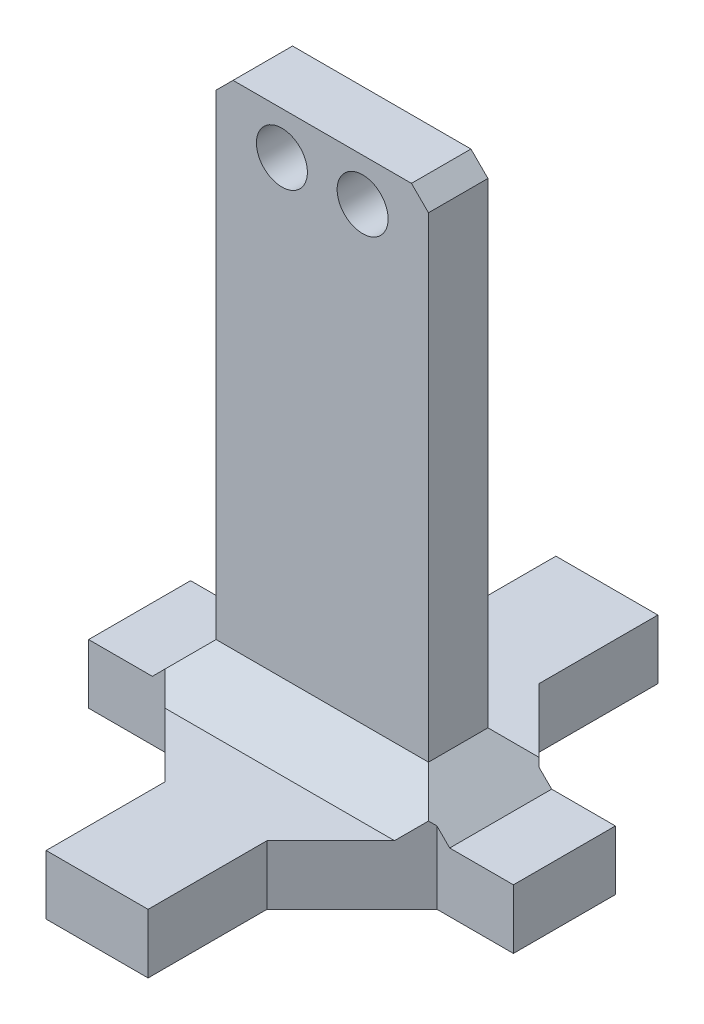
ISO-10303-21;
HEADER;
FILE_DESCRIPTION(('STEP AP214'),'2;1');
FILE_NAME('part.step','',(''),(''),'','','');
FILE_SCHEMA(('AUTOMOTIVE_DESIGN { 1 0 10303 214 1 1 1 1 }'));
ENDSEC;
DATA;
#1=APPLICATION_CONTEXT('core data for automotive mechanical design processes');
#2=APPLICATION_PROTOCOL_DEFINITION('international standard','automotive_design',2000,#1);
#3=PRODUCT_CONTEXT('',#1,'mechanical');
#4=PRODUCT('Part','Part','',(#3));
#5=PRODUCT_RELATED_PRODUCT_CATEGORY('part','',(#4));
#6=PRODUCT_DEFINITION_FORMATION('','',#4);
#7=PRODUCT_DEFINITION_CONTEXT('part definition',#1,'design');
#8=PRODUCT_DEFINITION('design','',#6,#7);
#9=PRODUCT_DEFINITION_SHAPE('','',#8);
#10=(LENGTH_UNIT() NAMED_UNIT(*) SI_UNIT(.MILLI.,.METRE.));
#11=(NAMED_UNIT(*) PLANE_ANGLE_UNIT() SI_UNIT($,.RADIAN.));
#12=(NAMED_UNIT(*) SI_UNIT($,.STERADIAN.) SOLID_ANGLE_UNIT());
#13=UNCERTAINTY_MEASURE_WITH_UNIT(LENGTH_MEASURE(1.E-05),#10,'distance_accuracy_value','');
#14=(GEOMETRIC_REPRESENTATION_CONTEXT(3) GLOBAL_UNCERTAINTY_ASSIGNED_CONTEXT((#13)) GLOBAL_UNIT_ASSIGNED_CONTEXT((#10,
#11,#12)) REPRESENTATION_CONTEXT('',''));
#15=CARTESIAN_POINT('',(0.,0.,0.));
#16=DIRECTION('',(0.,0.,1.));
#17=DIRECTION('',(1.,0.,0.));
#18=AXIS2_PLACEMENT_3D('',#15,#16,#17);
#19=CARTESIAN_POINT('',(0.,7.,0.));
#20=DIRECTION('',(0.,-1.,0.));
#21=DIRECTION('',(0.,0.,-1.));
#22=AXIS2_PLACEMENT_3D('',#19,#20,#21);
#23=PLANE('',#22);
#24=DIRECTION('',(1.,0.,0.));
#25=VECTOR('',#24,1.);
#26=CARTESIAN_POINT('',(0.,7.,-2.5));
#27=LINE('',#26,#25);
#28=CARTESIAN_POINT('',(30.,7.,-2.50000000000001));
#29=VERTEX_POINT('',#28);
#30=CARTESIAN_POINT('',(37.5,7.,-2.50000000000001));
#31=VERTEX_POINT('',#30);
#32=EDGE_CURVE('E270',#29,#31,#27,.T.);
#33=ORIENTED_EDGE('',*,*,#32,.F.);
#34=DIRECTION('',(0.,0.,1.));
#35=VECTOR('',#34,1.);
#36=CARTESIAN_POINT('',(30.,7.,12.));
#37=LINE('',#36,#35);
#38=CARTESIAN_POINT('',(30.,7.,9.50000000000001));
#39=VERTEX_POINT('',#38);
#40=EDGE_CURVE('E391',#29,#39,#37,.T.);
#41=ORIENTED_EDGE('',*,*,#40,.T.);
#42=DIRECTION('',(1.,0.,0.));
#43=VECTOR('',#42,1.);
#44=CARTESIAN_POINT('',(0.,7.,9.5));
#45=LINE('',#44,#43);
#46=CARTESIAN_POINT('',(37.5,7.,9.50000000000001));
#47=VERTEX_POINT('',#46);
#48=EDGE_CURVE('E248',#39,#47,#45,.T.);
#49=ORIENTED_EDGE('',*,*,#48,.T.);
#50=DIRECTION('',(0.,0.,-1.));
#51=VECTOR('',#50,1.);
#52=CARTESIAN_POINT('',(37.5,7.,0.));
#53=LINE('',#52,#51);
#54=EDGE_CURVE('E243',#47,#31,#53,.T.);
#55=ORIENTED_EDGE('',*,*,#54,.T.);
#56=EDGE_LOOP('',(#33,#41,#49,#55));
#57=FACE_BOUND('',#56,.T.);
#58=ADVANCED_FACE('F35',(#57),#23,.F.);
#59=DIRECTION('',(-0.707106781186552,0.,0.707106781186543));
#60=VECTOR('',#59,1.);
#61=CARTESIAN_POINT('',(18.9999999999999,7.,19.0000000000001));
#62=LINE('',#61,#60);
#63=CARTESIAN_POINT('',(18.5,7.,19.4999999999999));
#64=VERTEX_POINT('',#63);
#65=CARTESIAN_POINT('',(26.,7.,12.));
#66=VERTEX_POINT('',#65);
#67=EDGE_CURVE('E377',#64,#66,#62,.F.);
#68=ORIENTED_EDGE('',*,*,#67,.T.);
#69=DIRECTION('',(-1.,0.,0.));
#70=VECTOR('',#69,1.);
#71=CARTESIAN_POINT('',(0.,7.,12.));
#72=LINE('',#71,#70);
#73=CARTESIAN_POINT('',(-0.999999999999971,7.,12.));
#74=VERTEX_POINT('',#73);
#75=EDGE_CURVE('E381',#66,#74,#72,.T.);
#76=ORIENTED_EDGE('',*,*,#75,.T.);
#77=DIRECTION('',(0.707106781186543,0.,0.707106781186552));
#78=VECTOR('',#77,1.);
#79=CARTESIAN_POINT('',(-6.5,7.,6.49999999999992));
#80=LINE('',#79,#78);
#81=CARTESIAN_POINT('',(6.5,7.,19.5000000000001));
#82=VERTEX_POINT('',#81);
#83=EDGE_CURVE('E364',#74,#82,#80,.T.);
#84=ORIENTED_EDGE('',*,*,#83,.T.);
#85=DIRECTION('',(0.,0.,-1.));
#86=VECTOR('',#85,1.);
#87=CARTESIAN_POINT('',(6.5,7.,0.));
#88=LINE('',#87,#86);
#89=CARTESIAN_POINT('',(6.5,7.,33.5));
#90=VERTEX_POINT('',#89);
#91=EDGE_CURVE('E231',#90,#82,#88,.T.);
#92=ORIENTED_EDGE('',*,*,#91,.F.);
#93=DIRECTION('',(1.,0.,0.));
#94=VECTOR('',#93,1.);
#95=CARTESIAN_POINT('',(0.,7.,33.5));
#96=LINE('',#95,#94);
#97=CARTESIAN_POINT('',(18.5,7.,33.5));
#98=VERTEX_POINT('',#97);
#99=EDGE_CURVE('E223',#90,#98,#96,.T.);
#100=ORIENTED_EDGE('',*,*,#99,.T.);
#101=DIRECTION('',(0.,0.,-1.));
#102=VECTOR('',#101,1.);
#103=CARTESIAN_POINT('',(18.5,7.,0.));
#104=LINE('',#103,#102);
#105=EDGE_CURVE('E228',#98,#64,#104,.T.);
#106=ORIENTED_EDGE('',*,*,#105,.T.);
#107=EDGE_LOOP('',(#68,#76,#84,#92,#100,#106));
#108=FACE_BOUND('',#107,.T.);
#109=ADVANCED_FACE('F226',(#108),#23,.F.);
#110=DIRECTION('',(1.,0.,0.));
#111=VECTOR('',#110,1.);
#112=CARTESIAN_POINT('',(0.,7.,9.5));
#113=LINE('',#112,#111);
#114=CARTESIAN_POINT('',(-12.5,7.,9.5));
#115=VERTEX_POINT('',#114);
#116=CARTESIAN_POINT('',(-5.00000000000003,7.,9.5));
#117=VERTEX_POINT('',#116);
#118=EDGE_CURVE('E254',#115,#117,#113,.T.);
#119=ORIENTED_EDGE('',*,*,#118,.T.);
#120=DIRECTION('',(0.,0.,-1.));
#121=VECTOR('',#120,1.);
#122=CARTESIAN_POINT('',(-5.00000000000003,7.,-4.99999999999998));
#123=LINE('',#122,#121);
#124=CARTESIAN_POINT('',(-5.00000000000003,7.,-2.5));
#125=VERTEX_POINT('',#124);
#126=EDGE_CURVE('E389',#117,#125,#123,.T.);
#127=ORIENTED_EDGE('',*,*,#126,.T.);
#128=DIRECTION('',(1.,0.,0.));
#129=VECTOR('',#128,1.);
#130=CARTESIAN_POINT('',(0.,7.,-2.5));
#131=LINE('',#130,#129);
#132=CARTESIAN_POINT('',(-12.5,7.,-2.5));
#133=VERTEX_POINT('',#132);
#134=EDGE_CURVE('E260',#133,#125,#131,.T.);
#135=ORIENTED_EDGE('',*,*,#134,.F.);
#136=DIRECTION('',(0.,0.,-1.));
#137=VECTOR('',#136,1.);
#138=CARTESIAN_POINT('',(-12.5,7.,0.));
#139=LINE('',#138,#137);
#140=EDGE_CURVE('E257',#115,#133,#139,.T.);
#141=ORIENTED_EDGE('',*,*,#140,.F.);
#142=EDGE_LOOP('',(#119,#127,#135,#141));
#143=FACE_BOUND('',#142,.T.);
#144=ADVANCED_FACE('F567',(#143),#23,.F.);
#145=CARTESIAN_POINT('',(0.,0.,7.));
#146=DIRECTION('',(0.,0.,-1.));
#147=DIRECTION('',(-1.,0.,0.));
#148=AXIS2_PLACEMENT_3D('',#145,#146,#147);
#149=PLANE('',#148);
#150=CARTESIAN_POINT('',(7.75,65.,7.));
#151=DIRECTION('',(0.,0.,1.));
#152=DIRECTION('',(1.,0.,0.));
#153=AXIS2_PLACEMENT_3D('',#150,#151,#152);
#154=CIRCLE('',#153,3.);
#155=CARTESIAN_POINT('',(10.75,65.,7.));
#156=VERTEX_POINT('',#155);
#157=EDGE_CURVE('E320',#156,#156,#154,.T.);
#158=ORIENTED_EDGE('',*,*,#157,.F.);
#159=EDGE_LOOP('',(#158));
#160=FACE_BOUND('',#159,.T.);
#161=CARTESIAN_POINT('',(17.25,65.,7.));
#162=DIRECTION('',(0.,0.,1.));
#163=DIRECTION('',(1.,0.,0.));
#164=AXIS2_PLACEMENT_3D('',#161,#162,#163);
#165=CIRCLE('',#164,3.);
#166=CARTESIAN_POINT('',(20.25,65.,7.));
#167=VERTEX_POINT('',#166);
#168=EDGE_CURVE('E326',#167,#167,#165,.T.);
#169=ORIENTED_EDGE('',*,*,#168,.F.);
#170=EDGE_LOOP('',(#169));
#171=FACE_BOUND('',#170,.T.);
#172=DIRECTION('',(-1.,0.,0.));
#173=VECTOR('',#172,1.);
#174=CARTESIAN_POINT('',(0.,70.,7.));
#175=LINE('',#174,#173);
#176=CARTESIAN_POINT('',(23.,70.,7.));
#177=VERTEX_POINT('',#176);
#178=CARTESIAN_POINT('',(2.,70.,7.));
#179=VERTEX_POINT('',#178);
#180=EDGE_CURVE('E337',#177,#179,#175,.T.);
#181=ORIENTED_EDGE('',*,*,#180,.T.);
#182=DIRECTION('',(0.707106781186552,0.707106781186543,0.));
#183=VECTOR('',#182,1.);
#184=CARTESIAN_POINT('',(0.,68.,7.));
#185=LINE('',#184,#183);
#186=CARTESIAN_POINT('',(0.,68.,7.));
#187=VERTEX_POINT('',#186);
#188=EDGE_CURVE('E43',#179,#187,#185,.F.);
#189=ORIENTED_EDGE('',*,*,#188,.T.);
#190=DIRECTION('',(0.,-1.,0.));
#191=VECTOR('',#190,1.);
#192=CARTESIAN_POINT('',(0.,0.,7.));
#193=LINE('',#192,#191);
#194=CARTESIAN_POINT('',(0.,12.,7.));
#195=VERTEX_POINT('',#194);
#196=EDGE_CURVE('E332',#187,#195,#193,.T.);
#197=ORIENTED_EDGE('',*,*,#196,.T.);
#198=DIRECTION('',(1.,0.,0.));
#199=VECTOR('',#198,1.);
#200=CARTESIAN_POINT('',(25.,12.,7.));
#201=LINE('',#200,#199);
#202=CARTESIAN_POINT('',(25.,12.,7.));
#203=VERTEX_POINT('',#202);
#204=EDGE_CURVE('E383',#195,#203,#201,.T.);
#205=ORIENTED_EDGE('',*,*,#204,.T.);
#206=DIRECTION('',(0.,1.,0.));
#207=VECTOR('',#206,1.);
#208=CARTESIAN_POINT('',(25.,0.,7.));
#209=LINE('',#208,#207);
#210=CARTESIAN_POINT('',(25.,68.,7.));
#211=VERTEX_POINT('',#210);
#212=EDGE_CURVE('E334',#203,#211,#209,.T.);
#213=ORIENTED_EDGE('',*,*,#212,.T.);
#214=DIRECTION('',(0.707106781186548,-0.707106781186547,0.));
#215=VECTOR('',#214,1.);
#216=CARTESIAN_POINT('',(23.,70.,7.));
#217=LINE('',#216,#215);
#218=EDGE_CURVE('E450',#211,#177,#217,.F.);
#219=ORIENTED_EDGE('',*,*,#218,.T.);
#220=EDGE_LOOP('',(#181,#189,#197,#205,#213,#219));
#221=FACE_BOUND('',#220,.T.);
#222=ADVANCED_FACE('F454',(#160,#171,#221),#149,.F.);
#223=CARTESIAN_POINT('',(0.,0.,0.));
#224=DIRECTION('',(0.,0.,-1.));
#225=DIRECTION('',(-1.,0.,0.));
#226=AXIS2_PLACEMENT_3D('',#223,#224,#225);
#227=PLANE('',#226);
#228=CARTESIAN_POINT('',(17.25,65.,0.));
#229=DIRECTION('',(0.,0.,1.));
#230=DIRECTION('',(1.,0.,0.));
#231=AXIS2_PLACEMENT_3D('',#228,#229,#230);
#232=CIRCLE('',#231,3.);
#233=CARTESIAN_POINT('',(20.25,65.,0.));
#234=VERTEX_POINT('',#233);
#235=EDGE_CURVE('E323',#234,#234,#232,.T.);
#236=ORIENTED_EDGE('',*,*,#235,.T.);
#237=EDGE_LOOP('',(#236));
#238=FACE_BOUND('',#237,.T.);
#239=CARTESIAN_POINT('',(7.75,65.,0.));
#240=DIRECTION('',(0.,0.,1.));
#241=DIRECTION('',(1.,0.,0.));
#242=AXIS2_PLACEMENT_3D('',#239,#240,#241);
#243=CIRCLE('',#242,3.);
#244=CARTESIAN_POINT('',(10.75,65.,0.));
#245=VERTEX_POINT('',#244);
#246=EDGE_CURVE('E305',#245,#245,#243,.T.);
#247=ORIENTED_EDGE('',*,*,#246,.T.);
#248=EDGE_LOOP('',(#247));
#249=FACE_BOUND('',#248,.T.);
#250=DIRECTION('',(0.,-1.,0.));
#251=VECTOR('',#250,1.);
#252=CARTESIAN_POINT('',(0.,0.,0.));
#253=LINE('',#252,#251);
#254=CARTESIAN_POINT('',(0.,68.,0.));
#255=VERTEX_POINT('',#254);
#256=CARTESIAN_POINT('',(0.,12.,0.));
#257=VERTEX_POINT('',#256);
#258=EDGE_CURVE('E329',#255,#257,#253,.T.);
#259=ORIENTED_EDGE('',*,*,#258,.F.);
#260=DIRECTION('',(-0.707106781186552,-0.707106781186543,0.));
#261=VECTOR('',#260,1.);
#262=CARTESIAN_POINT('',(-34.,34.0000000000005,0.));
#263=LINE('',#262,#261);
#264=CARTESIAN_POINT('',(2.,70.,0.));
#265=VERTEX_POINT('',#264);
#266=EDGE_CURVE('E444',#255,#265,#263,.F.);
#267=ORIENTED_EDGE('',*,*,#266,.T.);
#268=DIRECTION('',(-1.,0.,0.));
#269=VECTOR('',#268,1.);
#270=CARTESIAN_POINT('',(0.,70.,0.));
#271=LINE('',#270,#269);
#272=CARTESIAN_POINT('',(23.,70.,0.));
#273=VERTEX_POINT('',#272);
#274=EDGE_CURVE('E335',#273,#265,#271,.T.);
#275=ORIENTED_EDGE('',*,*,#274,.F.);
#276=DIRECTION('',(-0.707106781186548,0.707106781186547,0.));
#277=VECTOR('',#276,1.);
#278=CARTESIAN_POINT('',(46.5,46.5000000000001,0.));
#279=LINE('',#278,#277);
#280=CARTESIAN_POINT('',(25.,68.,0.));
#281=VERTEX_POINT('',#280);
#282=EDGE_CURVE('E442',#273,#281,#279,.F.);
#283=ORIENTED_EDGE('',*,*,#282,.T.);
#284=DIRECTION('',(0.,1.,0.));
#285=VECTOR('',#284,1.);
#286=CARTESIAN_POINT('',(25.,0.,0.));
#287=LINE('',#286,#285);
#288=CARTESIAN_POINT('',(25.,12.,0.));
#289=VERTEX_POINT('',#288);
#290=EDGE_CURVE('E341',#289,#281,#287,.T.);
#291=ORIENTED_EDGE('',*,*,#290,.F.);
#292=DIRECTION('',(-1.,0.,0.));
#293=VECTOR('',#292,1.);
#294=CARTESIAN_POINT('',(0.,12.,0.));
#295=LINE('',#294,#293);
#296=EDGE_CURVE('E386',#289,#257,#295,.T.);
#297=ORIENTED_EDGE('',*,*,#296,.T.);
#298=EDGE_LOOP('',(#259,#267,#275,#283,#291,#297));
#299=FACE_BOUND('',#298,.T.);
#300=ADVANCED_FACE('F465',(#238,#249,#299),#227,.T.);
#301=CARTESIAN_POINT('',(0.,0.,7.));
#302=DIRECTION('',(1.,0.,0.));
#303=DIRECTION('',(0.,1.,0.));
#304=AXIS2_PLACEMENT_3D('',#301,#302,#303);
#305=PLANE('',#304);
#306=ORIENTED_EDGE('',*,*,#196,.F.);
#307=DIRECTION('',(0.,0.,-1.));
#308=VECTOR('',#307,1.);
#309=CARTESIAN_POINT('',(0.,68.,7.));
#310=LINE('',#309,#308);
#311=EDGE_CURVE('E437',#187,#255,#310,.T.);
#312=ORIENTED_EDGE('',*,*,#311,.T.);
#313=ORIENTED_EDGE('',*,*,#258,.T.);
#314=DIRECTION('',(0.,0.,1.));
#315=VECTOR('',#314,1.);
#316=CARTESIAN_POINT('',(0.,12.,12.));
#317=LINE('',#316,#315);
#318=EDGE_CURVE('E395',#257,#195,#317,.T.);
#319=ORIENTED_EDGE('',*,*,#318,.T.);
#320=EDGE_LOOP('',(#306,#312,#313,#319));
#321=FACE_BOUND('',#320,.T.);
#322=ADVANCED_FACE('F458',(#321),#305,.F.);
#323=CARTESIAN_POINT('',(25.,0.,7.));
#324=DIRECTION('',(-1.,0.,0.));
#325=DIRECTION('',(0.,-1.,0.));
#326=AXIS2_PLACEMENT_3D('',#323,#324,#325);
#327=PLANE('',#326);
#328=ORIENTED_EDGE('',*,*,#290,.T.);
#329=DIRECTION('',(0.,0.,1.));
#330=VECTOR('',#329,1.);
#331=CARTESIAN_POINT('',(25.,68.,7.));
#332=LINE('',#331,#330);
#333=EDGE_CURVE('E11',#281,#211,#332,.T.);
#334=ORIENTED_EDGE('',*,*,#333,.T.);
#335=ORIENTED_EDGE('',*,*,#212,.F.);
#336=DIRECTION('',(0.,0.,-1.));
#337=VECTOR('',#336,1.);
#338=CARTESIAN_POINT('',(25.,12.,-4.99999999999998));
#339=LINE('',#338,#337);
#340=EDGE_CURVE('E393',#203,#289,#339,.T.);
#341=ORIENTED_EDGE('',*,*,#340,.T.);
#342=EDGE_LOOP('',(#328,#334,#335,#341));
#343=FACE_BOUND('',#342,.T.);
#344=ADVANCED_FACE('F472',(#343),#327,.F.);
#345=CARTESIAN_POINT('',(0.,70.,7.));
#346=DIRECTION('',(0.,-1.,0.));
#347=DIRECTION('',(0.,0.,-1.));
#348=AXIS2_PLACEMENT_3D('',#345,#346,#347);
#349=PLANE('',#348);
#350=ORIENTED_EDGE('',*,*,#274,.T.);
#351=DIRECTION('',(0.,0.,1.));
#352=VECTOR('',#351,1.);
#353=CARTESIAN_POINT('',(2.,70.,7.));
#354=LINE('',#353,#352);
#355=EDGE_CURVE('E56',#265,#179,#354,.T.);
#356=ORIENTED_EDGE('',*,*,#355,.T.);
#357=ORIENTED_EDGE('',*,*,#180,.F.);
#358=DIRECTION('',(0.,0.,-1.));
#359=VECTOR('',#358,1.);
#360=CARTESIAN_POINT('',(23.,70.,7.));
#361=LINE('',#360,#359);
#362=EDGE_CURVE('E446',#177,#273,#361,.T.);
#363=ORIENTED_EDGE('',*,*,#362,.T.);
#364=EDGE_LOOP('',(#350,#356,#357,#363));
#365=FACE_BOUND('',#364,.T.);
#366=ADVANCED_FACE('F466',(#365),#349,.F.);
#367=CARTESIAN_POINT('',(17.25,65.,7.));
#368=DIRECTION('',(0.,0.,-1.));
#369=DIRECTION('',(-1.,0.,0.));
#370=AXIS2_PLACEMENT_3D('',#367,#368,#369);
#371=CYLINDRICAL_SURFACE('',#370,3.);
#372=ORIENTED_EDGE('',*,*,#168,.T.);
#373=EDGE_LOOP('',(#372));
#374=FACE_BOUND('',#373,.T.);
#375=ORIENTED_EDGE('',*,*,#235,.F.);
#376=EDGE_LOOP('',(#375));
#377=FACE_BOUND('',#376,.T.);
#378=ADVANCED_FACE('F576',(#374,#377),#371,.F.);
#379=CARTESIAN_POINT('',(7.75,65.,7.));
#380=DIRECTION('',(0.,0.,-1.));
#381=DIRECTION('',(-1.,0.,0.));
#382=AXIS2_PLACEMENT_3D('',#379,#380,#381);
#383=CYLINDRICAL_SURFACE('',#382,3.);
#384=ORIENTED_EDGE('',*,*,#157,.T.);
#385=EDGE_LOOP('',(#384));
#386=FACE_BOUND('',#385,.T.);
#387=ORIENTED_EDGE('',*,*,#246,.F.);
#388=EDGE_LOOP('',(#387));
#389=FACE_BOUND('',#388,.T.);
#390=ADVANCED_FACE('F570',(#386,#389),#383,.F.);
#391=DIRECTION('',(1.,0.,0.));
#392=VECTOR('',#391,1.);
#393=CARTESIAN_POINT('',(0.,7.,-4.99999999999998));
#394=LINE('',#393,#392);
#395=CARTESIAN_POINT('',(-1.00000000000009,7.,-4.99999999999998));
#396=VERTEX_POINT('',#395);
#397=CARTESIAN_POINT('',(26.,7.,-4.99999999999998));
#398=VERTEX_POINT('',#397);
#399=EDGE_CURVE('E379',#396,#398,#394,.T.);
#400=ORIENTED_EDGE('',*,*,#399,.T.);
#401=DIRECTION('',(-0.707106781186544,0.,-0.707106781186551));
#402=VECTOR('',#401,1.);
#403=CARTESIAN_POINT('',(15.5000000000001,7.,-15.5));
#404=LINE('',#403,#402);
#405=CARTESIAN_POINT('',(18.5,7.,-12.5000000000001));
#406=VERTEX_POINT('',#405);
#407=EDGE_CURVE('E373',#398,#406,#404,.T.);
#408=ORIENTED_EDGE('',*,*,#407,.T.);
#409=DIRECTION('',(0.,0.,-1.));
#410=VECTOR('',#409,1.);
#411=CARTESIAN_POINT('',(18.5,7.,0.));
#412=LINE('',#411,#410);
#413=CARTESIAN_POINT('',(18.5,7.,-26.5));
#414=VERTEX_POINT('',#413);
#415=EDGE_CURVE('E268',#406,#414,#412,.T.);
#416=ORIENTED_EDGE('',*,*,#415,.T.);
#417=DIRECTION('',(1.,0.,0.));
#418=VECTOR('',#417,1.);
#419=CARTESIAN_POINT('',(0.,7.,-26.5));
#420=LINE('',#419,#418);
#421=CARTESIAN_POINT('',(6.5,7.,-26.5));
#422=VERTEX_POINT('',#421);
#423=EDGE_CURVE('E265',#422,#414,#420,.T.);
#424=ORIENTED_EDGE('',*,*,#423,.F.);
#425=DIRECTION('',(0.,0.,-1.));
#426=VECTOR('',#425,1.);
#427=CARTESIAN_POINT('',(6.5,7.,0.));
#428=LINE('',#427,#426);
#429=CARTESIAN_POINT('',(6.5,7.,-12.5));
#430=VERTEX_POINT('',#429);
#431=EDGE_CURVE('E263',#430,#422,#428,.T.);
#432=ORIENTED_EDGE('',*,*,#431,.F.);
#433=DIRECTION('',(0.707106781186551,0.,-0.707106781186544));
#434=VECTOR('',#433,1.);
#435=CARTESIAN_POINT('',(-3.00000000000003,7.,-3.00000000000006));
#436=LINE('',#435,#434);
#437=EDGE_CURVE('E368',#430,#396,#436,.F.);
#438=ORIENTED_EDGE('',*,*,#437,.T.);
#439=EDGE_LOOP('',(#400,#408,#416,#424,#432,#438));
#440=FACE_BOUND('',#439,.T.);
#441=ADVANCED_FACE('F491',(#440),#23,.F.);
#442=CARTESIAN_POINT('',(0.,7.,9.5));
#443=DIRECTION('',(0.,0.,-1.));
#444=DIRECTION('',(-1.,0.,0.));
#445=AXIS2_PLACEMENT_3D('',#442,#443,#444);
#446=PLANE('',#445);
#447=ORIENTED_EDGE('',*,*,#48,.F.);
#448=DIRECTION('',(0.707106781186551,-0.707106781186545,0.));
#449=VECTOR('',#448,1.);
#450=CARTESIAN_POINT('',(14.9999999999999,22.,9.50000000000001));
#451=LINE('',#450,#449);
#452=CARTESIAN_POINT('',(28.5,8.49999999999998,9.50000000000001));
#453=VERTEX_POINT('',#452);
#454=EDGE_CURVE('E403',#39,#453,#451,.F.);
#455=ORIENTED_EDGE('',*,*,#454,.T.);
#456=DIRECTION('',(0.,-1.,0.));
#457=VECTOR('',#456,1.);
#458=CARTESIAN_POINT('',(28.5,0.,9.50000000000001));
#459=LINE('',#458,#457);
#460=CARTESIAN_POINT('',(28.5,0.,9.50000000000001));
#461=VERTEX_POINT('',#460);
#462=EDGE_CURVE('E358',#453,#461,#459,.T.);
#463=ORIENTED_EDGE('',*,*,#462,.T.);
#464=DIRECTION('',(1.,0.,0.));
#465=VECTOR('',#464,1.);
#466=CARTESIAN_POINT('',(0.,0.,9.5));
#467=LINE('',#466,#465);
#468=CARTESIAN_POINT('',(37.5,0.,9.50000000000001));
#469=VERTEX_POINT('',#468);
#470=EDGE_CURVE('E274',#461,#469,#467,.T.);
#471=ORIENTED_EDGE('',*,*,#470,.T.);
#472=DIRECTION('',(0.,-1.,0.));
#473=VECTOR('',#472,1.);
#474=CARTESIAN_POINT('',(37.5,7.,9.50000000000001));
#475=LINE('',#474,#473);
#476=EDGE_CURVE('E302',#47,#469,#475,.T.);
#477=ORIENTED_EDGE('',*,*,#476,.F.);
#478=EDGE_LOOP('',(#447,#455,#463,#471,#477));
#479=FACE_BOUND('',#478,.T.);
#480=ADVANCED_FACE('F537',(#479),#446,.F.);
#481=CARTESIAN_POINT('',(37.5,7.,0.));
#482=DIRECTION('',(-1.,0.,0.));
#483=DIRECTION('',(0.,0.,1.));
#484=AXIS2_PLACEMENT_3D('',#481,#482,#483);
#485=PLANE('',#484);
#486=DIRECTION('',(0.,0.,-1.));
#487=VECTOR('',#486,1.);
#488=CARTESIAN_POINT('',(37.5,0.,0.));
#489=LINE('',#488,#487);
#490=CARTESIAN_POINT('',(37.5,0.,-2.50000000000001));
#491=VERTEX_POINT('',#490);
#492=EDGE_CURVE('E250',#469,#491,#489,.T.);
#493=ORIENTED_EDGE('',*,*,#492,.T.);
#494=DIRECTION('',(0.,-1.,0.));
#495=VECTOR('',#494,1.);
#496=CARTESIAN_POINT('',(37.5,7.,-2.50000000000001));
#497=LINE('',#496,#495);
#498=EDGE_CURVE('E306',#31,#491,#497,.T.);
#499=ORIENTED_EDGE('',*,*,#498,.F.);
#500=ORIENTED_EDGE('',*,*,#54,.F.);
#501=ORIENTED_EDGE('',*,*,#476,.T.);
#502=EDGE_LOOP('',(#493,#499,#500,#501));
#503=FACE_BOUND('',#502,.T.);
#504=ADVANCED_FACE('F544',(#503),#485,.F.);
#505=CARTESIAN_POINT('',(0.,7.,-2.5));
#506=DIRECTION('',(0.,0.,-1.));
#507=DIRECTION('',(-1.,0.,0.));
#508=AXIS2_PLACEMENT_3D('',#505,#506,#507);
#509=PLANE('',#508);
#510=DIRECTION('',(1.,0.,0.));
#511=VECTOR('',#510,1.);
#512=CARTESIAN_POINT('',(0.,0.,-2.5));
#513=LINE('',#512,#511);
#514=CARTESIAN_POINT('',(28.5,0.,-2.50000000000001));
#515=VERTEX_POINT('',#514);
#516=EDGE_CURVE('E298',#515,#491,#513,.T.);
#517=ORIENTED_EDGE('',*,*,#516,.F.);
#518=DIRECTION('',(0.,1.,0.));
#519=VECTOR('',#518,1.);
#520=CARTESIAN_POINT('',(28.5,7.,-2.50000000000001));
#521=LINE('',#520,#519);
#522=CARTESIAN_POINT('',(28.5,8.50000000000005,-2.50000000000001));
#523=VERTEX_POINT('',#522);
#524=EDGE_CURVE('E356',#515,#523,#521,.T.);
#525=ORIENTED_EDGE('',*,*,#524,.T.);
#526=DIRECTION('',(-0.707106781186551,0.707106781186545,0.));
#527=VECTOR('',#526,1.);
#528=CARTESIAN_POINT('',(30.,7.,-2.50000000000001));
#529=LINE('',#528,#527);
#530=EDGE_CURVE('E401',#523,#29,#529,.F.);
#531=ORIENTED_EDGE('',*,*,#530,.T.);
#532=ORIENTED_EDGE('',*,*,#32,.T.);
#533=ORIENTED_EDGE('',*,*,#498,.T.);
#534=EDGE_LOOP('',(#517,#525,#531,#532,#533));
#535=FACE_BOUND('',#534,.T.);
#536=ADVANCED_FACE('F548',(#535),#509,.T.);
#537=CARTESIAN_POINT('',(18.5,7.,0.));
#538=DIRECTION('',(-1.,0.,0.));
#539=DIRECTION('',(0.,0.,1.));
#540=AXIS2_PLACEMENT_3D('',#537,#538,#539);
#541=PLANE('',#540);
#542=ORIENTED_EDGE('',*,*,#415,.F.);
#543=DIRECTION('',(0.,-1.,0.));
#544=VECTOR('',#543,1.);
#545=CARTESIAN_POINT('',(18.5,7.,-12.5000000000001));
#546=LINE('',#545,#544);
#547=CARTESIAN_POINT('',(18.5,0.,-12.5000000000001));
#548=VERTEX_POINT('',#547);
#549=EDGE_CURVE('E353',#406,#548,#546,.T.);
#550=ORIENTED_EDGE('',*,*,#549,.T.);
#551=DIRECTION('',(0.,0.,-1.));
#552=VECTOR('',#551,1.);
#553=CARTESIAN_POINT('',(18.5,0.,0.));
#554=LINE('',#553,#552);
#555=CARTESIAN_POINT('',(18.5,0.,-26.5));
#556=VERTEX_POINT('',#555);
#557=EDGE_CURVE('E296',#548,#556,#554,.T.);
#558=ORIENTED_EDGE('',*,*,#557,.T.);
#559=DIRECTION('',(0.,-1.,0.));
#560=VECTOR('',#559,1.);
#561=CARTESIAN_POINT('',(18.5,7.,-26.5));
#562=LINE('',#561,#560);
#563=EDGE_CURVE('E309',#414,#556,#562,.T.);
#564=ORIENTED_EDGE('',*,*,#563,.F.);
#565=EDGE_LOOP('',(#542,#550,#558,#564));
#566=FACE_BOUND('',#565,.T.);
#567=ADVANCED_FACE('F495',(#566),#541,.F.);
#568=CARTESIAN_POINT('',(0.,7.,-26.5));
#569=DIRECTION('',(0.,0.,-1.));
#570=DIRECTION('',(-1.,0.,0.));
#571=AXIS2_PLACEMENT_3D('',#568,#569,#570);
#572=PLANE('',#571);
#573=DIRECTION('',(1.,0.,0.));
#574=VECTOR('',#573,1.);
#575=CARTESIAN_POINT('',(0.,0.,-26.5));
#576=LINE('',#575,#574);
#577=CARTESIAN_POINT('',(6.5,0.,-26.5));
#578=VERTEX_POINT('',#577);
#579=EDGE_CURVE('E293',#578,#556,#576,.T.);
#580=ORIENTED_EDGE('',*,*,#579,.F.);
#581=DIRECTION('',(0.,-1.,0.));
#582=VECTOR('',#581,1.);
#583=CARTESIAN_POINT('',(6.5,7.,-26.5));
#584=LINE('',#583,#582);
#585=EDGE_CURVE('E312',#422,#578,#584,.T.);
#586=ORIENTED_EDGE('',*,*,#585,.F.);
#587=ORIENTED_EDGE('',*,*,#423,.T.);
#588=ORIENTED_EDGE('',*,*,#563,.T.);
#589=EDGE_LOOP('',(#580,#586,#587,#588));
#590=FACE_BOUND('',#589,.T.);
#591=ADVANCED_FACE('F500',(#590),#572,.T.);
#592=CARTESIAN_POINT('',(6.5,7.,0.));
#593=DIRECTION('',(-1.,0.,0.));
#594=DIRECTION('',(0.,0.,1.));
#595=AXIS2_PLACEMENT_3D('',#592,#593,#594);
#596=PLANE('',#595);
#597=DIRECTION('',(0.,0.,-1.));
#598=VECTOR('',#597,1.);
#599=CARTESIAN_POINT('',(6.5,0.,0.));
#600=LINE('',#599,#598);
#601=CARTESIAN_POINT('',(6.5,0.,-12.5));
#602=VERTEX_POINT('',#601);
#603=EDGE_CURVE('E291',#602,#578,#600,.T.);
#604=ORIENTED_EDGE('',*,*,#603,.F.);
#605=DIRECTION('',(0.,1.,0.));
#606=VECTOR('',#605,1.);
#607=CARTESIAN_POINT('',(6.5,7.,-12.5));
#608=LINE('',#607,#606);
#609=EDGE_CURVE('E351',#602,#430,#608,.T.);
#610=ORIENTED_EDGE('',*,*,#609,.T.);
#611=ORIENTED_EDGE('',*,*,#431,.T.);
#612=ORIENTED_EDGE('',*,*,#585,.T.);
#613=EDGE_LOOP('',(#604,#610,#611,#612));
#614=FACE_BOUND('',#613,.T.);
#615=ADVANCED_FACE('F550',(#614),#596,.T.);
#616=CARTESIAN_POINT('',(0.,7.,-2.5));
#617=DIRECTION('',(0.,0.,-1.));
#618=DIRECTION('',(-1.,0.,0.));
#619=AXIS2_PLACEMENT_3D('',#616,#617,#618);
#620=PLANE('',#619);
#621=ORIENTED_EDGE('',*,*,#134,.T.);
#622=DIRECTION('',(-0.707106781186551,-0.707106781186545,0.));
#623=VECTOR('',#622,1.);
#624=CARTESIAN_POINT('',(-5.00000000000003,7.,-2.5));
#625=LINE('',#624,#623);
#626=CARTESIAN_POINT('',(-3.50000000000009,8.49999999999993,-2.5));
#627=VERTEX_POINT('',#626);
#628=EDGE_CURVE('E417',#125,#627,#625,.F.);
#629=ORIENTED_EDGE('',*,*,#628,.T.);
#630=DIRECTION('',(0.,-1.,0.));
#631=VECTOR('',#630,1.);
#632=CARTESIAN_POINT('',(-3.50000000000009,0.,-2.5));
#633=LINE('',#632,#631);
#634=CARTESIAN_POINT('',(-3.50000000000009,0.,-2.5));
#635=VERTEX_POINT('',#634);
#636=EDGE_CURVE('E348',#627,#635,#633,.T.);
#637=ORIENTED_EDGE('',*,*,#636,.T.);
#638=DIRECTION('',(1.,0.,0.));
#639=VECTOR('',#638,1.);
#640=CARTESIAN_POINT('',(0.,0.,-2.5));
#641=LINE('',#640,#639);
#642=CARTESIAN_POINT('',(-12.5,0.,-2.5));
#643=VERTEX_POINT('',#642);
#644=EDGE_CURVE('E288',#643,#635,#641,.T.);
#645=ORIENTED_EDGE('',*,*,#644,.F.);
#646=DIRECTION('',(0.,-1.,0.));
#647=VECTOR('',#646,1.);
#648=CARTESIAN_POINT('',(-12.5,7.,-2.5));
#649=LINE('',#648,#647);
#650=EDGE_CURVE('E315',#133,#643,#649,.T.);
#651=ORIENTED_EDGE('',*,*,#650,.F.);
#652=EDGE_LOOP('',(#621,#629,#637,#645,#651));
#653=FACE_BOUND('',#652,.T.);
#654=ADVANCED_FACE('F552',(#653),#620,.T.);
#655=CARTESIAN_POINT('',(-12.5,7.,0.));
#656=DIRECTION('',(-1.,0.,0.));
#657=DIRECTION('',(0.,0.,1.));
#658=AXIS2_PLACEMENT_3D('',#655,#656,#657);
#659=PLANE('',#658);
#660=DIRECTION('',(0.,0.,-1.));
#661=VECTOR('',#660,1.);
#662=CARTESIAN_POINT('',(-12.5,0.,0.));
#663=LINE('',#662,#661);
#664=CARTESIAN_POINT('',(-12.5,0.,9.5));
#665=VERTEX_POINT('',#664);
#666=EDGE_CURVE('E285',#665,#643,#663,.T.);
#667=ORIENTED_EDGE('',*,*,#666,.F.);
#668=DIRECTION('',(0.,-1.,0.));
#669=VECTOR('',#668,1.);
#670=CARTESIAN_POINT('',(-12.5,7.,9.5));
#671=LINE('',#670,#669);
#672=EDGE_CURVE('E317',#115,#665,#671,.T.);
#673=ORIENTED_EDGE('',*,*,#672,.F.);
#674=ORIENTED_EDGE('',*,*,#140,.T.);
#675=ORIENTED_EDGE('',*,*,#650,.T.);
#676=EDGE_LOOP('',(#667,#673,#674,#675));
#677=FACE_BOUND('',#676,.T.);
#678=ADVANCED_FACE('F558',(#677),#659,.T.);
#679=CARTESIAN_POINT('',(0.,7.,9.5));
#680=DIRECTION('',(0.,0.,-1.));
#681=DIRECTION('',(-1.,0.,0.));
#682=AXIS2_PLACEMENT_3D('',#679,#680,#681);
#683=PLANE('',#682);
#684=DIRECTION('',(1.,0.,0.));
#685=VECTOR('',#684,1.);
#686=CARTESIAN_POINT('',(0.,0.,9.5));
#687=LINE('',#686,#685);
#688=CARTESIAN_POINT('',(-3.49999999999996,0.,9.5));
#689=VERTEX_POINT('',#688);
#690=EDGE_CURVE('E282',#665,#689,#687,.T.);
#691=ORIENTED_EDGE('',*,*,#690,.T.);
#692=DIRECTION('',(0.,1.,0.));
#693=VECTOR('',#692,1.);
#694=CARTESIAN_POINT('',(-3.49999999999996,7.,9.5));
#695=LINE('',#694,#693);
#696=CARTESIAN_POINT('',(-3.49999999999996,8.50000000000007,9.5));
#697=VERTEX_POINT('',#696);
#698=EDGE_CURVE('E346',#689,#697,#695,.T.);
#699=ORIENTED_EDGE('',*,*,#698,.T.);
#700=DIRECTION('',(0.707106781186551,0.707106781186545,0.));
#701=VECTOR('',#700,1.);
#702=CARTESIAN_POINT('',(-2.5,9.50000000000002,9.5));
#703=LINE('',#702,#701);
#704=EDGE_CURVE('E415',#697,#117,#703,.F.);
#705=ORIENTED_EDGE('',*,*,#704,.T.);
#706=ORIENTED_EDGE('',*,*,#118,.F.);
#707=ORIENTED_EDGE('',*,*,#672,.T.);
#708=EDGE_LOOP('',(#691,#699,#705,#706,#707));
#709=FACE_BOUND('',#708,.T.);
#710=ADVANCED_FACE('F596',(#709),#683,.F.);
#711=CARTESIAN_POINT('',(6.5,7.,0.));
#712=DIRECTION('',(-1.,0.,0.));
#713=DIRECTION('',(0.,0.,1.));
#714=AXIS2_PLACEMENT_3D('',#711,#712,#713);
#715=PLANE('',#714);
#716=ORIENTED_EDGE('',*,*,#91,.T.);
#717=DIRECTION('',(0.,-1.,0.));
#718=VECTOR('',#717,1.);
#719=CARTESIAN_POINT('',(6.5,7.,19.5000000000001));
#720=LINE('',#719,#718);
#721=CARTESIAN_POINT('',(6.5,0.,19.5000000000001));
#722=VERTEX_POINT('',#721);
#723=EDGE_CURVE('E339',#82,#722,#720,.T.);
#724=ORIENTED_EDGE('',*,*,#723,.T.);
#725=DIRECTION('',(0.,0.,-1.));
#726=VECTOR('',#725,1.);
#727=CARTESIAN_POINT('',(6.5,0.,0.));
#728=LINE('',#727,#726);
#729=CARTESIAN_POINT('',(6.5,0.,33.5));
#730=VERTEX_POINT('',#729);
#731=EDGE_CURVE('E279',#730,#722,#728,.T.);
#732=ORIENTED_EDGE('',*,*,#731,.F.);
#733=DIRECTION('',(0.,-1.,0.));
#734=VECTOR('',#733,1.);
#735=CARTESIAN_POINT('',(6.5,7.,33.5));
#736=LINE('',#735,#734);
#737=EDGE_CURVE('E242',#90,#730,#736,.T.);
#738=ORIENTED_EDGE('',*,*,#737,.F.);
#739=EDGE_LOOP('',(#716,#724,#732,#738));
#740=FACE_BOUND('',#739,.T.);
#741=ADVANCED_FACE('F525',(#740),#715,.T.);
#742=CARTESIAN_POINT('',(0.,7.,33.5));
#743=DIRECTION('',(0.,0.,-1.));
#744=DIRECTION('',(-1.,0.,0.));
#745=AXIS2_PLACEMENT_3D('',#742,#743,#744);
#746=PLANE('',#745);
#747=DIRECTION('',(1.,0.,0.));
#748=VECTOR('',#747,1.);
#749=CARTESIAN_POINT('',(0.,0.,33.5));
#750=LINE('',#749,#748);
#751=CARTESIAN_POINT('',(18.5,0.,33.5));
#752=VERTEX_POINT('',#751);
#753=EDGE_CURVE('E238',#730,#752,#750,.T.);
#754=ORIENTED_EDGE('',*,*,#753,.T.);
#755=DIRECTION('',(0.,-1.,0.));
#756=VECTOR('',#755,1.);
#757=CARTESIAN_POINT('',(18.5,7.,33.5));
#758=LINE('',#757,#756);
#759=EDGE_CURVE('E235',#98,#752,#758,.T.);
#760=ORIENTED_EDGE('',*,*,#759,.F.);
#761=ORIENTED_EDGE('',*,*,#99,.F.);
#762=ORIENTED_EDGE('',*,*,#737,.T.);
#763=EDGE_LOOP('',(#754,#760,#761,#762));
#764=FACE_BOUND('',#763,.T.);
#765=ADVANCED_FACE('F236',(#764),#746,.F.);
#766=CARTESIAN_POINT('',(18.5,7.,0.));
#767=DIRECTION('',(-1.,0.,0.));
#768=DIRECTION('',(0.,0.,1.));
#769=AXIS2_PLACEMENT_3D('',#766,#767,#768);
#770=PLANE('',#769);
#771=DIRECTION('',(0.,0.,-1.));
#772=VECTOR('',#771,1.);
#773=CARTESIAN_POINT('',(18.5,0.,0.));
#774=LINE('',#773,#772);
#775=CARTESIAN_POINT('',(18.5,0.,19.4999999999999));
#776=VERTEX_POINT('',#775);
#777=EDGE_CURVE('E276',#752,#776,#774,.T.);
#778=ORIENTED_EDGE('',*,*,#777,.T.);
#779=DIRECTION('',(0.,1.,0.));
#780=VECTOR('',#779,1.);
#781=CARTESIAN_POINT('',(18.5,7.,19.4999999999999));
#782=LINE('',#781,#780);
#783=EDGE_CURVE('E247',#776,#64,#782,.T.);
#784=ORIENTED_EDGE('',*,*,#783,.T.);
#785=ORIENTED_EDGE('',*,*,#105,.F.);
#786=ORIENTED_EDGE('',*,*,#759,.T.);
#787=EDGE_LOOP('',(#778,#784,#785,#786));
#788=FACE_BOUND('',#787,.T.);
#789=ADVANCED_FACE('F245',(#788),#770,.F.);
#790=CARTESIAN_POINT('',(0.,0.,7.));
#791=DIRECTION('',(0.,1.,0.));
#792=DIRECTION('',(0.,0.,1.));
#793=AXIS2_PLACEMENT_3D('',#790,#791,#792);
#794=PLANE('',#793);
#795=ORIENTED_EDGE('',*,*,#470,.F.);
#796=DIRECTION('',(0.707106781186552,0.,-0.707106781186543));
#797=VECTOR('',#796,1.);
#798=CARTESIAN_POINT('',(15.4999999999999,0.,22.5));
#799=LINE('',#798,#797);
#800=EDGE_CURVE('E375',#461,#776,#799,.F.);
#801=ORIENTED_EDGE('',*,*,#800,.T.);
#802=ORIENTED_EDGE('',*,*,#777,.F.);
#803=ORIENTED_EDGE('',*,*,#753,.F.);
#804=ORIENTED_EDGE('',*,*,#731,.T.);
#805=DIRECTION('',(-0.707106781186543,0.,-0.707106781186552));
#806=VECTOR('',#805,1.);
#807=CARTESIAN_POINT('',(-3.,0.,9.99999999999996));
#808=LINE('',#807,#806);
#809=EDGE_CURVE('E362',#722,#689,#808,.T.);
#810=ORIENTED_EDGE('',*,*,#809,.T.);
#811=ORIENTED_EDGE('',*,*,#690,.F.);
#812=ORIENTED_EDGE('',*,*,#666,.T.);
#813=ORIENTED_EDGE('',*,*,#644,.T.);
#814=DIRECTION('',(-0.707106781186551,0.,0.707106781186544));
#815=VECTOR('',#814,1.);
#816=CARTESIAN_POINT('',(-6.50000000000003,0.,0.4999999999999));
#817=LINE('',#816,#815);
#818=EDGE_CURVE('E366',#635,#602,#817,.F.);
#819=ORIENTED_EDGE('',*,*,#818,.T.);
#820=ORIENTED_EDGE('',*,*,#603,.T.);
#821=ORIENTED_EDGE('',*,*,#579,.T.);
#822=ORIENTED_EDGE('',*,*,#557,.F.);
#823=DIRECTION('',(0.707106781186544,0.,0.707106781186551));
#824=VECTOR('',#823,1.);
#825=CARTESIAN_POINT('',(19.0000000000001,0.,-11.9999999999999));
#826=LINE('',#825,#824);
#827=EDGE_CURVE('E371',#548,#515,#826,.T.);
#828=ORIENTED_EDGE('',*,*,#827,.T.);
#829=ORIENTED_EDGE('',*,*,#516,.T.);
#830=ORIENTED_EDGE('',*,*,#492,.F.);
#831=EDGE_LOOP('',(#795,#801,#802,#803,#804,#810,#811,#812,#813,#819,#820,#821,#822,#828,#829,#830));
#832=FACE_BOUND('',#831,.T.);
#833=ADVANCED_FACE('F529',(#832),#794,.F.);
#834=CARTESIAN_POINT('',(6.5,7.,19.5000000000001));
#835=DIRECTION('',(0.707106781186552,0.,-0.707106781186543));
#836=DIRECTION('',(0.,-1.,0.));
#837=AXIS2_PLACEMENT_3D('',#834,#835,#836);
#838=PLANE('',#837);
#839=ORIENTED_EDGE('',*,*,#83,.F.);
#840=DIRECTION('',(0.577350269189623,-0.577350269189624,0.57735026918963));
#841=VECTOR('',#840,1.);
#842=CARTESIAN_POINT('',(4.00000000000002,2.,17.0000000000001));
#843=LINE('',#842,#841);
#844=CARTESIAN_POINT('',(-2.99999999999999,9.00000000000003,9.99999999999997));
#845=VERTEX_POINT('',#844);
#846=EDGE_CURVE('E432',#74,#845,#843,.F.);
#847=ORIENTED_EDGE('',*,*,#846,.T.);
#848=DIRECTION('',(0.577350269189625,0.57735026918962,0.577350269189632));
#849=VECTOR('',#848,1.);
#850=CARTESIAN_POINT('',(2.66666666666673,14.6666666666667,15.6666666666668));
#851=LINE('',#850,#849);
#852=EDGE_CURVE('E412',#845,#697,#851,.F.);
#853=ORIENTED_EDGE('',*,*,#852,.T.);
#854=ORIENTED_EDGE('',*,*,#698,.F.);
#855=ORIENTED_EDGE('',*,*,#809,.F.);
#856=ORIENTED_EDGE('',*,*,#723,.F.);
#857=EDGE_LOOP('',(#839,#847,#853,#854,#855,#856));
#858=FACE_BOUND('',#857,.T.);
#859=ADVANCED_FACE('F521',(#858),#838,.F.);
#860=CARTESIAN_POINT('',(-3.50000000000009,7.,-2.5));
#861=DIRECTION('',(-0.707106781186543,0.,-0.707106781186551));
#862=DIRECTION('',(0.,1.,0.));
#863=AXIS2_PLACEMENT_3D('',#860,#861,#862);
#864=PLANE('',#863);
#865=ORIENTED_EDGE('',*,*,#437,.F.);
#866=ORIENTED_EDGE('',*,*,#609,.F.);
#867=ORIENTED_EDGE('',*,*,#818,.F.);
#868=ORIENTED_EDGE('',*,*,#636,.F.);
#869=DIRECTION('',(0.57735026918963,0.577350269189625,-0.577350269189623));
#870=VECTOR('',#869,1.);
#871=CARTESIAN_POINT('',(-4.00000000000007,7.99999999999995,-2.00000000000003));
#872=LINE('',#871,#870);
#873=CARTESIAN_POINT('',(-3.00000000000005,8.99999999999996,-3.00000000000004));
#874=VERTEX_POINT('',#873);
#875=EDGE_CURVE('E420',#627,#874,#872,.T.);
#876=ORIENTED_EDGE('',*,*,#875,.T.);
#877=DIRECTION('',(-0.577350269189628,0.577350269189628,0.577350269189622));
#878=VECTOR('',#877,1.);
#879=CARTESIAN_POINT('',(-2.66666666666675,8.66666666666666,-3.33333333333333));
#880=LINE('',#879,#878);
#881=EDGE_CURVE('E431',#396,#874,#880,.T.);
#882=ORIENTED_EDGE('',*,*,#881,.F.);
#883=EDGE_LOOP('',(#865,#866,#867,#868,#876,#882));
#884=FACE_BOUND('',#883,.T.);
#885=ADVANCED_FACE('F507',(#884),#864,.T.);
#886=CARTESIAN_POINT('',(18.5,7.,-12.5000000000001));
#887=DIRECTION('',(-0.707106781186551,0.,0.707106781186544));
#888=DIRECTION('',(0.,-1.,0.));
#889=AXIS2_PLACEMENT_3D('',#886,#887,#888);
#890=PLANE('',#889);
#891=ORIENTED_EDGE('',*,*,#407,.F.);
#892=DIRECTION('',(0.57735026918962,0.577350269189632,0.577350269189626));
#893=VECTOR('',#892,1.);
#894=CARTESIAN_POINT('',(21.0000000000001,1.99999999999993,-9.99999999999999));
#895=LINE('',#894,#893);
#896=CARTESIAN_POINT('',(28.,9.00000000000001,-2.99999999999998));
#897=VERTEX_POINT('',#896);
#898=EDGE_CURVE('E427',#398,#897,#895,.T.);
#899=ORIENTED_EDGE('',*,*,#898,.T.);
#900=DIRECTION('',(-0.577350269189626,0.577350269189621,-0.577350269189631));
#901=VECTOR('',#900,1.);
#902=CARTESIAN_POINT('',(22.3333333333333,14.6666666666667,-8.66666666666676));
#903=LINE('',#902,#901);
#904=EDGE_CURVE('E398',#897,#523,#903,.F.);
#905=ORIENTED_EDGE('',*,*,#904,.T.);
#906=ORIENTED_EDGE('',*,*,#524,.F.);
#907=ORIENTED_EDGE('',*,*,#827,.F.);
#908=ORIENTED_EDGE('',*,*,#549,.F.);
#909=EDGE_LOOP('',(#891,#899,#905,#906,#907,#908));
#910=FACE_BOUND('',#909,.T.);
#911=ADVANCED_FACE('F486',(#910),#890,.F.);
#912=CARTESIAN_POINT('',(28.5,7.,9.50000000000001));
#913=DIRECTION('',(0.707106781186543,0.,0.707106781186552));
#914=DIRECTION('',(0.,1.,0.));
#915=AXIS2_PLACEMENT_3D('',#912,#913,#914);
#916=PLANE('',#915);
#917=ORIENTED_EDGE('',*,*,#67,.F.);
#918=ORIENTED_EDGE('',*,*,#783,.F.);
#919=ORIENTED_EDGE('',*,*,#800,.F.);
#920=ORIENTED_EDGE('',*,*,#462,.F.);
#921=DIRECTION('',(-0.57735026918963,0.577350269189625,0.577350269189623));
#922=VECTOR('',#921,1.);
#923=CARTESIAN_POINT('',(29.,7.99999999999998,9.00000000000002));
#924=LINE('',#923,#922);
#925=CARTESIAN_POINT('',(28.,8.99999999999998,10.));
#926=VERTEX_POINT('',#925);
#927=EDGE_CURVE('E406',#453,#926,#924,.T.);
#928=ORIENTED_EDGE('',*,*,#927,.T.);
#929=DIRECTION('',(-0.577350269189632,-0.577350269189619,0.577350269189626));
#930=VECTOR('',#929,1.);
#931=CARTESIAN_POINT('',(27.6666666666667,8.66666666666667,10.3333333333333));
#932=LINE('',#931,#930);
#933=EDGE_CURVE('E428',#66,#926,#932,.F.);
#934=ORIENTED_EDGE('',*,*,#933,.F.);
#935=EDGE_LOOP('',(#917,#918,#919,#920,#928,#934));
#936=FACE_BOUND('',#935,.T.);
#937=ADVANCED_FACE('F531',(#936),#916,.T.);
#938=CARTESIAN_POINT('',(0.,7.,12.));
#939=DIRECTION('',(0.,0.707106781186551,0.707106781186544));
#940=DIRECTION('',(1.,0.,0.));
#941=AXIS2_PLACEMENT_3D('',#938,#939,#940);
#942=PLANE('',#941);
#943=ORIENTED_EDGE('',*,*,#75,.F.);
#944=ORIENTED_EDGE('',*,*,#933,.T.);
#945=DIRECTION('',(-0.577350269189627,0.577350269189622,-0.577350269189628));
#946=VECTOR('',#945,1.);
#947=CARTESIAN_POINT('',(20.,17.,1.99999999999994));
#948=LINE('',#947,#946);
#949=EDGE_CURVE('E408',#926,#203,#948,.T.);
#950=ORIENTED_EDGE('',*,*,#949,.T.);
#951=ORIENTED_EDGE('',*,*,#204,.F.);
#952=DIRECTION('',(-0.577350269189627,-0.577350269189622,0.577350269189628));
#953=VECTOR('',#952,1.);
#954=CARTESIAN_POINT('',(-3.33333333333335,8.66666666666667,10.3333333333333));
#955=LINE('',#954,#953);
#956=EDGE_CURVE('E425',#195,#845,#955,.T.);
#957=ORIENTED_EDGE('',*,*,#956,.T.);
#958=ORIENTED_EDGE('',*,*,#846,.F.);
#959=EDGE_LOOP('',(#943,#944,#950,#951,#957,#958));
#960=FACE_BOUND('',#959,.T.);
#961=ADVANCED_FACE('F518',(#960),#942,.T.);
#962=CARTESIAN_POINT('',(0.,12.,0.));
#963=DIRECTION('',(0.,-0.707106781186544,0.707106781186551));
#964=DIRECTION('',(-1.,0.,0.));
#965=AXIS2_PLACEMENT_3D('',#962,#963,#964);
#966=PLANE('',#965);
#967=ORIENTED_EDGE('',*,*,#296,.F.);
#968=DIRECTION('',(-0.577350269189631,0.577350269189626,0.57735026918962));
#969=VECTOR('',#968,1.);
#970=CARTESIAN_POINT('',(16.6666666666665,20.3333333333334,8.33333333333331));
#971=LINE('',#970,#969);
#972=EDGE_CURVE('E410',#289,#897,#971,.F.);
#973=ORIENTED_EDGE('',*,*,#972,.T.);
#974=ORIENTED_EDGE('',*,*,#898,.F.);
#975=ORIENTED_EDGE('',*,*,#399,.F.);
#976=ORIENTED_EDGE('',*,*,#881,.T.);
#977=DIRECTION('',(-0.577350269189631,-0.577350269189626,-0.57735026918962));
#978=VECTOR('',#977,1.);
#979=CARTESIAN_POINT('',(0.,12.,0.));
#980=LINE('',#979,#978);
#981=EDGE_CURVE('E422',#874,#257,#980,.F.);
#982=ORIENTED_EDGE('',*,*,#981,.T.);
#983=EDGE_LOOP('',(#967,#973,#974,#975,#976,#982));
#984=FACE_BOUND('',#983,.T.);
#985=ADVANCED_FACE('F483',(#984),#966,.F.);
#986=CARTESIAN_POINT('',(30.,7.,0.));
#987=DIRECTION('',(0.707106781186545,0.707106781186551,0.));
#988=DIRECTION('',(0.,0.,-1.));
#989=AXIS2_PLACEMENT_3D('',#986,#987,#988);
#990=PLANE('',#989);
#991=ORIENTED_EDGE('',*,*,#972,.F.);
#992=ORIENTED_EDGE('',*,*,#340,.F.);
#993=ORIENTED_EDGE('',*,*,#949,.F.);
#994=ORIENTED_EDGE('',*,*,#927,.F.);
#995=ORIENTED_EDGE('',*,*,#454,.F.);
#996=ORIENTED_EDGE('',*,*,#40,.F.);
#997=ORIENTED_EDGE('',*,*,#530,.F.);
#998=ORIENTED_EDGE('',*,*,#904,.F.);
#999=EDGE_LOOP('',(#991,#992,#993,#994,#995,#996,#997,#998));
#1000=FACE_BOUND('',#999,.T.);
#1001=ADVANCED_FACE('F477',(#1000),#990,.T.);
#1002=CARTESIAN_POINT('',(-5.00000000000003,7.,0.));
#1003=DIRECTION('',(-0.707106781186545,0.707106781186551,0.));
#1004=DIRECTION('',(0.,0.,1.));
#1005=AXIS2_PLACEMENT_3D('',#1002,#1003,#1004);
#1006=PLANE('',#1005);
#1007=ORIENTED_EDGE('',*,*,#956,.F.);
#1008=ORIENTED_EDGE('',*,*,#318,.F.);
#1009=ORIENTED_EDGE('',*,*,#981,.F.);
#1010=ORIENTED_EDGE('',*,*,#875,.F.);
#1011=ORIENTED_EDGE('',*,*,#628,.F.);
#1012=ORIENTED_EDGE('',*,*,#126,.F.);
#1013=ORIENTED_EDGE('',*,*,#704,.F.);
#1014=ORIENTED_EDGE('',*,*,#852,.F.);
#1015=EDGE_LOOP('',(#1007,#1008,#1009,#1010,#1011,#1012,#1013,#1014));
#1016=FACE_BOUND('',#1015,.T.);
#1017=ADVANCED_FACE('F512',(#1016),#1006,.T.);
#1018=CARTESIAN_POINT('',(0.,68.,7.));
#1019=DIRECTION('',(0.707106781186543,-0.707106781186552,0.));
#1020=DIRECTION('',(0.,0.,-1.));
#1021=AXIS2_PLACEMENT_3D('',#1018,#1019,#1020);
#1022=PLANE('',#1021);
#1023=ORIENTED_EDGE('',*,*,#188,.F.);
#1024=ORIENTED_EDGE('',*,*,#355,.F.);
#1025=ORIENTED_EDGE('',*,*,#266,.F.);
#1026=ORIENTED_EDGE('',*,*,#311,.F.);
#1027=EDGE_LOOP('',(#1023,#1024,#1025,#1026));
#1028=FACE_BOUND('',#1027,.T.);
#1029=ADVANCED_FACE('F462',(#1028),#1022,.F.);
#1030=CARTESIAN_POINT('',(23.,70.,7.));
#1031=DIRECTION('',(-0.707106781186547,-0.707106781186548,0.));
#1032=DIRECTION('',(0.,0.,-1.));
#1033=AXIS2_PLACEMENT_3D('',#1030,#1031,#1032);
#1034=PLANE('',#1033);
#1035=ORIENTED_EDGE('',*,*,#218,.F.);
#1036=ORIENTED_EDGE('',*,*,#333,.F.);
#1037=ORIENTED_EDGE('',*,*,#282,.F.);
#1038=ORIENTED_EDGE('',*,*,#362,.F.);
#1039=EDGE_LOOP('',(#1035,#1036,#1037,#1038));
#1040=FACE_BOUND('',#1039,.T.);
#1041=ADVANCED_FACE('F37',(#1040),#1034,.F.);
#1042=CLOSED_SHELL('',(#58,#109,#144,#222,#300,#322,#344,#366,#378,#390,#441,#480,#504,#536,
#567,#591,#615,#654,#678,#710,#741,#765,#789,#833,#859,#885,#911,#937,#961,#985,#1001,#1017,
#1029,#1041));
#1043=MANIFOLD_SOLID_BREP('B2',#1042);
#1044=ADVANCED_BREP_SHAPE_REPRESENTATION('',(#18,#1043),#14);
#1045=SHAPE_DEFINITION_REPRESENTATION(#9,#1044);
ENDSEC;
END-ISO-10303-21;
